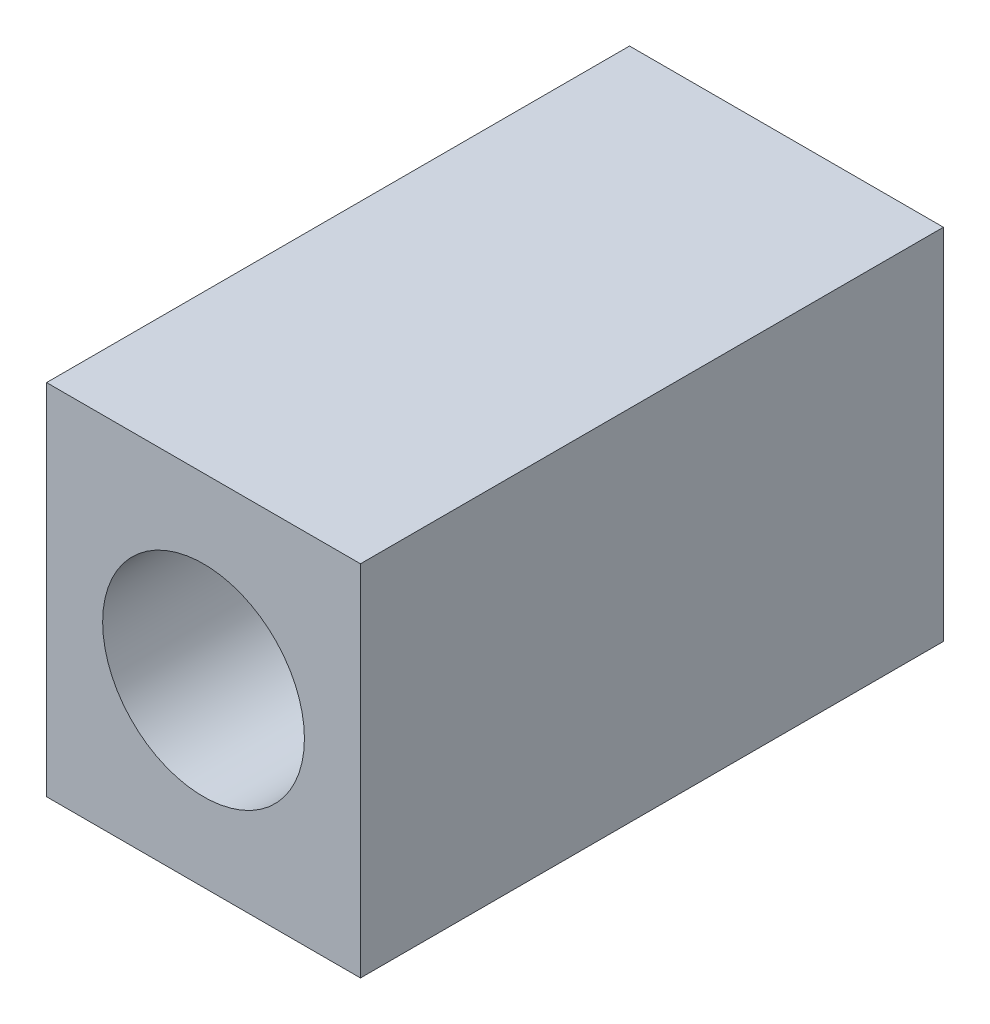
ISO-10303-21;
HEADER;
FILE_DESCRIPTION(('STEP AP214'),'2;1');
FILE_NAME('part.step','',(''),(''),'','','');
FILE_SCHEMA(('AUTOMOTIVE_DESIGN { 1 0 10303 214 1 1 1 1 }'));
ENDSEC;
DATA;
#1=APPLICATION_CONTEXT('core data for automotive mechanical design processes');
#2=APPLICATION_PROTOCOL_DEFINITION('international standard','automotive_design',2000,#1);
#3=PRODUCT_CONTEXT('',#1,'mechanical');
#4=PRODUCT('Part','Part','',(#3));
#5=PRODUCT_RELATED_PRODUCT_CATEGORY('part','',(#4));
#6=PRODUCT_DEFINITION_FORMATION('','',#4);
#7=PRODUCT_DEFINITION_CONTEXT('part definition',#1,'design');
#8=PRODUCT_DEFINITION('design','',#6,#7);
#9=PRODUCT_DEFINITION_SHAPE('','',#8);
#10=(LENGTH_UNIT() NAMED_UNIT(*) SI_UNIT(.MILLI.,.METRE.));
#11=(NAMED_UNIT(*) PLANE_ANGLE_UNIT() SI_UNIT($,.RADIAN.));
#12=(NAMED_UNIT(*) SI_UNIT($,.STERADIAN.) SOLID_ANGLE_UNIT());
#13=UNCERTAINTY_MEASURE_WITH_UNIT(LENGTH_MEASURE(1.E-05),#10,'distance_accuracy_value','');
#14=(GEOMETRIC_REPRESENTATION_CONTEXT(3) GLOBAL_UNCERTAINTY_ASSIGNED_CONTEXT((#13)) GLOBAL_UNIT_ASSIGNED_CONTEXT((#10,
#11,#12)) REPRESENTATION_CONTEXT('',''));
#15=CARTESIAN_POINT('',(0.,0.,0.));
#16=DIRECTION('',(0.,0.,1.));
#17=DIRECTION('',(1.,0.,0.));
#18=AXIS2_PLACEMENT_3D('',#15,#16,#17);
#19=CARTESIAN_POINT('',(0.,0.,13.));
#20=DIRECTION('',(0.,0.,-1.));
#21=DIRECTION('',(-1.,0.,0.));
#22=AXIS2_PLACEMENT_3D('',#19,#20,#21);
#23=PLANE('',#22);
#24=DIRECTION('',(0.,1.,0.));
#25=VECTOR('',#24,1.);
#26=CARTESIAN_POINT('',(3.5,-4.,13.));
#27=LINE('',#26,#25);
#28=CARTESIAN_POINT('',(3.5,-4.,13.));
#29=VERTEX_POINT('',#28);
#30=CARTESIAN_POINT('',(3.5,4.,13.));
#31=VERTEX_POINT('',#30);
#32=EDGE_CURVE('E85',#29,#31,#27,.T.);
#33=ORIENTED_EDGE('',*,*,#32,.T.);
#34=DIRECTION('',(-1.,0.,0.));
#35=VECTOR('',#34,1.);
#36=CARTESIAN_POINT('',(-3.5,4.,13.));
#37=LINE('',#36,#35);
#38=CARTESIAN_POINT('',(-3.5,4.,13.));
#39=VERTEX_POINT('',#38);
#40=EDGE_CURVE('E80',#31,#39,#37,.T.);
#41=ORIENTED_EDGE('',*,*,#40,.T.);
#42=DIRECTION('',(0.,-1.,0.));
#43=VECTOR('',#42,1.);
#44=CARTESIAN_POINT('',(-3.5,-4.,13.));
#45=LINE('',#44,#43);
#46=CARTESIAN_POINT('',(-3.5,-4.,13.));
#47=VERTEX_POINT('',#46);
#48=EDGE_CURVE('E83',#39,#47,#45,.T.);
#49=ORIENTED_EDGE('',*,*,#48,.T.);
#50=DIRECTION('',(1.,0.,0.));
#51=VECTOR('',#50,1.);
#52=CARTESIAN_POINT('',(-3.5,-4.,13.));
#53=LINE('',#52,#51);
#54=EDGE_CURVE('E50',#47,#29,#53,.T.);
#55=ORIENTED_EDGE('',*,*,#54,.T.);
#56=EDGE_LOOP('',(#33,#41,#49,#55));
#57=FACE_BOUND('',#56,.T.);
#58=CARTESIAN_POINT('',(0.,0.,13.));
#59=DIRECTION('',(0.,0.,1.));
#60=DIRECTION('',(1.,0.,0.));
#61=AXIS2_PLACEMENT_3D('',#58,#59,#60);
#62=CIRCLE('',#61,2.25);
#63=CARTESIAN_POINT('',(-2.25,0.,13.));
#64=VERTEX_POINT('',#63);
#65=EDGE_CURVE('E100',#64,#64,#62,.T.);
#66=ORIENTED_EDGE('',*,*,#65,.F.);
#67=EDGE_LOOP('',(#66));
#68=FACE_BOUND('',#67,.T.);
#69=ADVANCED_FACE('F33',(#57,#68),#23,.F.);
#70=CARTESIAN_POINT('',(0.,0.,0.));
#71=DIRECTION('',(0.,0.,-1.));
#72=DIRECTION('',(-1.,0.,0.));
#73=AXIS2_PLACEMENT_3D('',#70,#71,#72);
#74=PLANE('',#73);
#75=DIRECTION('',(0.,1.,0.));
#76=VECTOR('',#75,1.);
#77=CARTESIAN_POINT('',(3.5,-4.,0.));
#78=LINE('',#77,#76);
#79=CARTESIAN_POINT('',(3.5,-4.,0.));
#80=VERTEX_POINT('',#79);
#81=CARTESIAN_POINT('',(3.5,4.,0.));
#82=VERTEX_POINT('',#81);
#83=EDGE_CURVE('E97',#80,#82,#78,.T.);
#84=ORIENTED_EDGE('',*,*,#83,.F.);
#85=DIRECTION('',(1.,0.,0.));
#86=VECTOR('',#85,1.);
#87=CARTESIAN_POINT('',(-3.5,-4.,0.));
#88=LINE('',#87,#86);
#89=CARTESIAN_POINT('',(-3.5,-4.,0.));
#90=VERTEX_POINT('',#89);
#91=EDGE_CURVE('E73',#90,#80,#88,.T.);
#92=ORIENTED_EDGE('',*,*,#91,.F.);
#93=DIRECTION('',(0.,-1.,0.));
#94=VECTOR('',#93,1.);
#95=CARTESIAN_POINT('',(-3.5,-4.,0.));
#96=LINE('',#95,#94);
#97=CARTESIAN_POINT('',(-3.5,4.,0.));
#98=VERTEX_POINT('',#97);
#99=EDGE_CURVE('E67',#98,#90,#96,.T.);
#100=ORIENTED_EDGE('',*,*,#99,.F.);
#101=DIRECTION('',(-1.,0.,0.));
#102=VECTOR('',#101,1.);
#103=CARTESIAN_POINT('',(-3.5,4.,0.));
#104=LINE('',#103,#102);
#105=EDGE_CURVE('E89',#82,#98,#104,.T.);
#106=ORIENTED_EDGE('',*,*,#105,.F.);
#107=EDGE_LOOP('',(#84,#92,#100,#106));
#108=FACE_BOUND('',#107,.T.);
#109=CARTESIAN_POINT('',(0.,0.,0.));
#110=DIRECTION('',(0.,0.,1.));
#111=DIRECTION('',(1.,0.,0.));
#112=AXIS2_PLACEMENT_3D('',#109,#110,#111);
#113=CIRCLE('',#112,2.25);
#114=CARTESIAN_POINT('',(-2.25,0.,0.));
#115=VERTEX_POINT('',#114);
#116=EDGE_CURVE('E112',#115,#115,#113,.T.);
#117=ORIENTED_EDGE('',*,*,#116,.T.);
#118=EDGE_LOOP('',(#117));
#119=FACE_BOUND('',#118,.T.);
#120=ADVANCED_FACE('F108',(#108,#119),#74,.T.);
#121=CARTESIAN_POINT('',(3.5,-4.,13.));
#122=DIRECTION('',(-1.,0.,0.));
#123=DIRECTION('',(0.,0.,1.));
#124=AXIS2_PLACEMENT_3D('',#121,#122,#123);
#125=PLANE('',#124);
#126=ORIENTED_EDGE('',*,*,#83,.T.);
#127=DIRECTION('',(0.,0.,-1.));
#128=VECTOR('',#127,1.);
#129=CARTESIAN_POINT('',(3.5,4.,13.));
#130=LINE('',#129,#128);
#131=EDGE_CURVE('E11',#31,#82,#130,.T.);
#132=ORIENTED_EDGE('',*,*,#131,.F.);
#133=ORIENTED_EDGE('',*,*,#32,.F.);
#134=DIRECTION('',(0.,0.,-1.));
#135=VECTOR('',#134,1.);
#136=CARTESIAN_POINT('',(3.5,-4.,13.));
#137=LINE('',#136,#135);
#138=EDGE_CURVE('E93',#29,#80,#137,.T.);
#139=ORIENTED_EDGE('',*,*,#138,.T.);
#140=EDGE_LOOP('',(#126,#132,#133,#139));
#141=FACE_BOUND('',#140,.T.);
#142=ADVANCED_FACE('F35',(#141),#125,.F.);
#143=CARTESIAN_POINT('',(-3.5,4.,13.));
#144=DIRECTION('',(0.,-1.,0.));
#145=DIRECTION('',(0.,0.,-1.));
#146=AXIS2_PLACEMENT_3D('',#143,#144,#145);
#147=PLANE('',#146);
#148=ORIENTED_EDGE('',*,*,#105,.T.);
#149=DIRECTION('',(0.,0.,-1.));
#150=VECTOR('',#149,1.);
#151=CARTESIAN_POINT('',(-3.5,4.,13.));
#152=LINE('',#151,#150);
#153=EDGE_CURVE('E42',#39,#98,#152,.T.);
#154=ORIENTED_EDGE('',*,*,#153,.F.);
#155=ORIENTED_EDGE('',*,*,#40,.F.);
#156=ORIENTED_EDGE('',*,*,#131,.T.);
#157=EDGE_LOOP('',(#148,#154,#155,#156));
#158=FACE_BOUND('',#157,.T.);
#159=ADVANCED_FACE('F88',(#158),#147,.F.);
#160=CARTESIAN_POINT('',(-3.5,-4.,13.));
#161=DIRECTION('',(1.,0.,0.));
#162=DIRECTION('',(0.,0.,-1.));
#163=AXIS2_PLACEMENT_3D('',#160,#161,#162);
#164=PLANE('',#163);
#165=ORIENTED_EDGE('',*,*,#99,.T.);
#166=DIRECTION('',(0.,0.,-1.));
#167=VECTOR('',#166,1.);
#168=CARTESIAN_POINT('',(-3.5,-4.,13.));
#169=LINE('',#168,#167);
#170=EDGE_CURVE('E90',#47,#90,#169,.T.);
#171=ORIENTED_EDGE('',*,*,#170,.F.);
#172=ORIENTED_EDGE('',*,*,#48,.F.);
#173=ORIENTED_EDGE('',*,*,#153,.T.);
#174=EDGE_LOOP('',(#165,#171,#172,#173));
#175=FACE_BOUND('',#174,.T.);
#176=ADVANCED_FACE('F91',(#175),#164,.F.);
#177=CARTESIAN_POINT('',(-3.5,-4.,13.));
#178=DIRECTION('',(0.,1.,0.));
#179=DIRECTION('',(0.,0.,1.));
#180=AXIS2_PLACEMENT_3D('',#177,#178,#179);
#181=PLANE('',#180);
#182=CARTESIAN_POINT('',(0.,-4.,4.));
#183=DIRECTION('',(0.,-1.,0.));
#184=DIRECTION('',(0.,0.,-1.));
#185=AXIS2_PLACEMENT_3D('',#182,#183,#184);
#186=CIRCLE('',#185,1.75);
#187=CARTESIAN_POINT('',(0.,-4.,2.25));
#188=VERTEX_POINT('',#187);
#189=EDGE_CURVE('E118',#188,#188,#186,.T.);
#190=ORIENTED_EDGE('',*,*,#189,.F.);
#191=EDGE_LOOP('',(#190));
#192=FACE_BOUND('',#191,.T.);
#193=ORIENTED_EDGE('',*,*,#91,.T.);
#194=ORIENTED_EDGE('',*,*,#138,.F.);
#195=ORIENTED_EDGE('',*,*,#54,.F.);
#196=ORIENTED_EDGE('',*,*,#170,.T.);
#197=EDGE_LOOP('',(#193,#194,#195,#196));
#198=FACE_BOUND('',#197,.T.);
#199=ADVANCED_FACE('F105',(#192,#198),#181,.F.);
#200=CARTESIAN_POINT('',(0.,0.,13.));
#201=DIRECTION('',(0.,0.,-1.));
#202=DIRECTION('',(-1.,0.,0.));
#203=AXIS2_PLACEMENT_3D('',#200,#201,#202);
#204=CYLINDRICAL_SURFACE('',#203,2.25);
#205=CARTESIAN_POINT('',(-2.25,0.,13.));
#206=CARTESIAN_POINT('',(-2.25,0.,12.8645833333333));
#207=CARTESIAN_POINT('',(-2.25,0.,12.7291666666667));
#208=CARTESIAN_POINT('',(-2.25,0.,12.4583333333333));
#209=CARTESIAN_POINT('',(-2.25,0.,12.3229166666667));
#210=CARTESIAN_POINT('',(-2.25,0.,12.0520833333333));
#211=CARTESIAN_POINT('',(-2.25,0.,11.9166666666667));
#212=CARTESIAN_POINT('',(-2.25,0.,11.6458333333333));
#213=CARTESIAN_POINT('',(-2.25,0.,11.5104166666667));
#214=CARTESIAN_POINT('',(-2.25,0.,11.2395833333333));
#215=CARTESIAN_POINT('',(-2.25,0.,11.1041666666667));
#216=CARTESIAN_POINT('',(-2.25,0.,10.8333333333333));
#217=CARTESIAN_POINT('',(-2.25,0.,10.6979166666667));
#218=CARTESIAN_POINT('',(-2.25,0.,10.4270833333333));
#219=CARTESIAN_POINT('',(-2.25,0.,10.2916666666667));
#220=CARTESIAN_POINT('',(-2.25,0.,10.0208333333333));
#221=CARTESIAN_POINT('',(-2.25,0.,9.88541666666667));
#222=CARTESIAN_POINT('',(-2.25,0.,9.61458333333333));
#223=CARTESIAN_POINT('',(-2.25,0.,9.47916666666667));
#224=CARTESIAN_POINT('',(-2.25,0.,9.20833333333333));
#225=CARTESIAN_POINT('',(-2.25,0.,9.07291666666667));
#226=CARTESIAN_POINT('',(-2.25,0.,8.80208333333333));
#227=CARTESIAN_POINT('',(-2.25,0.,8.66666666666667));
#228=CARTESIAN_POINT('',(-2.25,0.,8.39583333333333));
#229=CARTESIAN_POINT('',(-2.25,0.,8.26041666666667));
#230=CARTESIAN_POINT('',(-2.25,0.,7.98958333333333));
#231=CARTESIAN_POINT('',(-2.25,0.,7.85416666666667));
#232=CARTESIAN_POINT('',(-2.25,0.,7.58333333333333));
#233=CARTESIAN_POINT('',(-2.25,0.,7.44791666666667));
#234=CARTESIAN_POINT('',(-2.25,0.,7.17708333333333));
#235=CARTESIAN_POINT('',(-2.25,0.,7.04166666666667));
#236=CARTESIAN_POINT('',(-2.25,0.,6.77083333333333));
#237=CARTESIAN_POINT('',(-2.25,0.,6.63541666666667));
#238=CARTESIAN_POINT('',(-2.25,0.,6.36458333333333));
#239=CARTESIAN_POINT('',(-2.25,0.,6.22916666666667));
#240=CARTESIAN_POINT('',(-2.25,0.,5.95833333333333));
#241=CARTESIAN_POINT('',(-2.25,0.,5.82291666666667));
#242=CARTESIAN_POINT('',(-2.25,0.,5.55208333333333));
#243=CARTESIAN_POINT('',(-2.25,0.,5.41666666666667));
#244=CARTESIAN_POINT('',(-2.25,0.,5.14583333333333));
#245=CARTESIAN_POINT('',(-2.25,0.,5.01041666666667));
#246=CARTESIAN_POINT('',(-2.25,0.,4.73958333333333));
#247=CARTESIAN_POINT('',(-2.25,0.,4.60416666666667));
#248=CARTESIAN_POINT('',(-2.25,0.,4.33333333333333));
#249=CARTESIAN_POINT('',(-2.25,0.,4.19791666666667));
#250=CARTESIAN_POINT('',(-2.25,0.,3.92708333333333));
#251=CARTESIAN_POINT('',(-2.25,0.,3.79166666666667));
#252=CARTESIAN_POINT('',(-2.25,0.,3.52083333333333));
#253=CARTESIAN_POINT('',(-2.25,0.,3.38541666666667));
#254=CARTESIAN_POINT('',(-2.25,0.,3.11458333333333));
#255=CARTESIAN_POINT('',(-2.25,0.,2.97916666666667));
#256=CARTESIAN_POINT('',(-2.25,0.,2.70833333333333));
#257=CARTESIAN_POINT('',(-2.25,0.,2.57291666666667));
#258=CARTESIAN_POINT('',(-2.25,0.,2.30208333333333));
#259=CARTESIAN_POINT('',(-2.25,0.,2.16666666666667));
#260=CARTESIAN_POINT('',(-2.25,0.,1.89583333333333));
#261=CARTESIAN_POINT('',(-2.25,0.,1.76041666666667));
#262=CARTESIAN_POINT('',(-2.25,0.,1.48958333333333));
#263=CARTESIAN_POINT('',(-2.25,0.,1.35416666666667));
#264=CARTESIAN_POINT('',(-2.25,0.,1.08333333333333));
#265=CARTESIAN_POINT('',(-2.25,0.,0.947916666666667));
#266=CARTESIAN_POINT('',(-2.25,0.,0.677083333333334));
#267=CARTESIAN_POINT('',(-2.25,0.,0.541666666666667));
#268=CARTESIAN_POINT('',(-2.25,0.,0.270833333333334));
#269=CARTESIAN_POINT('',(-2.25,0.,0.135416666666667));
#270=CARTESIAN_POINT('',(-2.25,0.,0.));
#271=B_SPLINE_CURVE_WITH_KNOTS('',3,(#205,#206,#207,#208,#209,#210,#211,#212,#213,#214,#215,
#216,#217,#218,#219,#220,#221,#222,#223,#224,#225,#226,#227,#228,#229,#230,#231,#232,#233,#234,
#235,#236,#237,#238,#239,#240,#241,#242,#243,#244,#245,#246,#247,#248,#249,#250,#251,#252,#253,
#254,#255,#256,#257,#258,#259,#260,#261,#262,#263,#264,#265,#266,#267,#268,#269,#270),
.UNSPECIFIED.,.F.,.F.,(4,2,2,2,2,2,2,2,2,2,2,2,2,2,2,2,2,2,2,2,2,2,2,2,2,2,2,2,2,2,2,2,4),(0.,
0.406249999999999,0.812499999999999,1.21875,1.625,2.03125,2.4375,2.84375,3.25,3.65625,4.0625,
4.46875,4.875,5.28125,5.6875,6.09375,6.5,6.90625,7.3125,7.71875,8.125,8.53125,8.9375,9.34375,
9.75,10.15625,10.5625,10.96875,11.375,11.78125,12.1875,12.59375,13.),.UNSPECIFIED.);
#272=EDGE_CURVE('BSEAM129',#64,#115,#271,.T.);
#273=ORIENTED_EDGE('',*,*,#65,.T.);
#274=ORIENTED_EDGE('',*,*,#116,.F.);
#275=ORIENTED_EDGE('',*,*,#272,.T.);
#276=ORIENTED_EDGE('',*,*,#272,.F.);
#277=EDGE_LOOP('',(#273,#275,#274,#276));
#278=FACE_BOUND('',#277,.T.);
#279=ADVANCED_FACE('F129',(#278),#204,.F.);
#280=CARTESIAN_POINT('',(0.,-3.,4.));
#281=DIRECTION('',(0.,-1.,0.));
#282=DIRECTION('',(0.,0.,-1.));
#283=AXIS2_PLACEMENT_3D('',#280,#281,#282);
#284=CYLINDRICAL_SURFACE('',#283,1.75);
#285=CARTESIAN_POINT('',(0.,-3.,4.));
#286=DIRECTION('',(0.,-1.,0.));
#287=DIRECTION('',(0.,0.,-1.));
#288=AXIS2_PLACEMENT_3D('',#285,#286,#287);
#289=CIRCLE('',#288,1.75);
#290=CARTESIAN_POINT('',(0.,-3.,2.25));
#291=VERTEX_POINT('',#290);
#292=EDGE_CURVE('E115',#291,#291,#289,.T.);
#293=ORIENTED_EDGE('',*,*,#292,.F.);
#294=EDGE_LOOP('',(#293));
#295=FACE_BOUND('',#294,.T.);
#296=ORIENTED_EDGE('',*,*,#189,.T.);
#297=EDGE_LOOP('',(#296));
#298=FACE_BOUND('',#297,.T.);
#299=ADVANCED_FACE('F126',(#295,#298),#284,.F.);
#300=CARTESIAN_POINT('',(0.,-3.,4.));
#301=DIRECTION('',(0.,-1.,0.));
#302=DIRECTION('',(0.,0.,-1.));
#303=AXIS2_PLACEMENT_3D('',#300,#301,#302);
#304=PLANE('',#303);
#305=ORIENTED_EDGE('',*,*,#292,.T.);
#306=EDGE_LOOP('',(#305));
#307=FACE_BOUND('',#306,.T.);
#308=ADVANCED_FACE('F124',(#307),#304,.T.);
#309=CLOSED_SHELL('',(#69,#120,#142,#159,#176,#199,#279,#299,#308));
#310=MANIFOLD_SOLID_BREP('B2',#309);
#311=ADVANCED_BREP_SHAPE_REPRESENTATION('',(#18,#310),#14);
#312=SHAPE_DEFINITION_REPRESENTATION(#9,#311);
ENDSEC;
END-ISO-10303-21;
